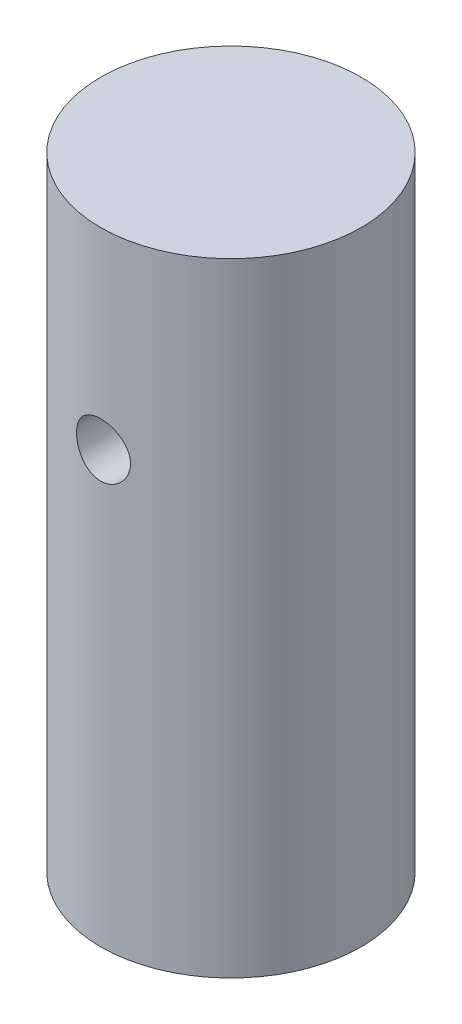
ISO-10303-21;
HEADER;
FILE_DESCRIPTION(('STEP AP214'),'2;1');
FILE_NAME('part.step','',(''),(''),'','','');
FILE_SCHEMA(('AUTOMOTIVE_DESIGN { 1 0 10303 214 1 1 1 1 }'));
ENDSEC;
DATA;
#1=APPLICATION_CONTEXT('core data for automotive mechanical design processes');
#2=APPLICATION_PROTOCOL_DEFINITION('international standard','automotive_design',2000,#1);
#3=PRODUCT_CONTEXT('',#1,'mechanical');
#4=PRODUCT('Part','Part','',(#3));
#5=PRODUCT_RELATED_PRODUCT_CATEGORY('part','',(#4));
#6=PRODUCT_DEFINITION_FORMATION('','',#4);
#7=PRODUCT_DEFINITION_CONTEXT('part definition',#1,'design');
#8=PRODUCT_DEFINITION('design','',#6,#7);
#9=PRODUCT_DEFINITION_SHAPE('','',#8);
#10=(LENGTH_UNIT() NAMED_UNIT(*) SI_UNIT(.MILLI.,.METRE.));
#11=(NAMED_UNIT(*) PLANE_ANGLE_UNIT() SI_UNIT($,.RADIAN.));
#12=(NAMED_UNIT(*) SI_UNIT($,.STERADIAN.) SOLID_ANGLE_UNIT());
#13=UNCERTAINTY_MEASURE_WITH_UNIT(LENGTH_MEASURE(1.E-05),#10,'distance_accuracy_value','');
#14=(GEOMETRIC_REPRESENTATION_CONTEXT(3) GLOBAL_UNCERTAINTY_ASSIGNED_CONTEXT((#13)) GLOBAL_UNIT_ASSIGNED_CONTEXT((#10,
#11,#12)) REPRESENTATION_CONTEXT('',''));
#15=CARTESIAN_POINT('',(0.,0.,0.));
#16=DIRECTION('',(0.,0.,1.));
#17=DIRECTION('',(1.,0.,0.));
#18=AXIS2_PLACEMENT_3D('',#15,#16,#17);
#19=CARTESIAN_POINT('',(0.,110.,0.));
#20=DIRECTION('',(0.,-1.,0.));
#21=DIRECTION('',(0.,0.,-1.));
#22=AXIS2_PLACEMENT_3D('',#19,#20,#21);
#23=CYLINDRICAL_SURFACE('',#22,23.);
#24=CARTESIAN_POINT('',(0.,80.7625,-23.));
#25=CARTESIAN_POINT('',(-0.264485032794885,80.7624905134433,-22.999995105829));
#26=CARTESIAN_POINT('',(-0.529088001707564,80.7403933447332,-22.9953912374659));
#27=CARTESIAN_POINT('',(-1.05080119514639,80.6526666070727,-22.9774697825828));
#28=CARTESIAN_POINT('',(-1.30790552969369,80.587003731269,-22.9641455292601));
#29=CARTESIAN_POINT('',(-1.80700413074042,80.4142718948397,-22.9302695755803));
#30=CARTESIAN_POINT('',(-2.04901308011091,80.3072439220144,-22.9097250314781));
#31=CARTESIAN_POINT('',(-2.51162532897361,80.0549449242048,-22.8636359691827));
#32=CARTESIAN_POINT('',(-2.73222963533514,79.9096756992747,-22.8380916863467));
#33=CARTESIAN_POINT('',(-3.14897535091243,79.5827914797964,-22.7843965936397));
#34=CARTESIAN_POINT('',(-3.34476261481203,79.4007297863869,-22.756216290215));
#35=CARTESIAN_POINT('',(-3.7032484752603,79.0063884952953,-22.7006373153975));
#36=CARTESIAN_POINT('',(-3.86594435767395,78.7941064213814,-22.6732387082773));
#37=CARTESIAN_POINT('',(-4.15515676952711,78.3427767069992,-22.6220363242689));
#38=CARTESIAN_POINT('',(-4.28130280415805,78.1034869725144,-22.5982704408082));
#39=CARTESIAN_POINT('',(-4.49146008129478,77.6065341001879,-22.5574449388681));
#40=CARTESIAN_POINT('',(-4.57547580463713,77.3488729196015,-22.5403846072508));
#41=CARTESIAN_POINT('',(-4.69783021579348,76.8263132389355,-22.5152010079109));
#42=CARTESIAN_POINT('',(-4.73679237252321,76.561566715561,-22.5069558757893));
#43=CARTESIAN_POINT('',(-4.769870971444,76.0291760947007,-22.4999697252763));
#44=CARTESIAN_POINT('',(-4.76399233704951,75.7615323185488,-22.5012276634698));
#45=CARTESIAN_POINT('',(-4.70805944236785,75.2355328503621,-22.5129949398179));
#46=CARTESIAN_POINT('',(-4.65872338051958,74.977096917896,-22.5233538635158));
#47=CARTESIAN_POINT('',(-4.5184112889846,74.4722513499182,-22.5519187300214));
#48=CARTESIAN_POINT('',(-4.42743314224264,74.2258423265511,-22.5701250717838));
#49=CARTESIAN_POINT('',(-4.20574335961059,73.7499941399755,-22.6124851139095));
#50=CARTESIAN_POINT('',(-4.07475019388072,73.5206900217328,-22.6366807158554));
#51=CARTESIAN_POINT('',(-3.77694717065477,73.0870494596982,-22.6882665925958));
#52=CARTESIAN_POINT('',(-3.61013291403111,72.8827160873619,-22.715657259582));
#53=CARTESIAN_POINT('',(-3.2415936049543,72.5006764651028,-22.7711963726726));
#54=CARTESIAN_POINT('',(-3.03925639596571,72.3235608549928,-22.7993492357394));
#55=CARTESIAN_POINT('',(-2.60744078443593,72.0056871640821,-22.8527570789761));
#56=CARTESIAN_POINT('',(-2.37796198419619,71.8649296161227,-22.8780120166726));
#57=CARTESIAN_POINT('',(-1.89769739115524,71.6236449989013,-22.9228475476254));
#58=CARTESIAN_POINT('',(-1.64687486034917,71.5231890690433,-22.9424180902752));
#59=CARTESIAN_POINT('',(-1.13141672629778,71.3660085038752,-22.9736041230192));
#60=CARTESIAN_POINT('',(-0.866782923819518,71.3092781825845,-22.9852206474143));
#61=CARTESIAN_POINT('',(-0.336286391951818,71.2420037947562,-22.999044565326));
#62=CARTESIAN_POINT('',(-0.0705302552791218,71.2306519818368,-23.001416495134));
#63=CARTESIAN_POINT('',(0.459081137409283,71.2522763460083,-22.9969424779101));
#64=CARTESIAN_POINT('',(0.722936507368175,71.2852498433698,-22.9900970881203));
#65=CARTESIAN_POINT('',(1.23862473603839,71.3939181761444,-22.9680608684261));
#66=CARTESIAN_POINT('',(1.4905494418103,71.4691951674719,-22.9529517007581));
#67=CARTESIAN_POINT('',(1.97819939632065,71.6598744134402,-22.9160768644794));
#68=CARTESIAN_POINT('',(2.21392336608105,71.7752798316989,-22.894310671063));
#69=CARTESIAN_POINT('',(2.66586273277865,72.0446636749177,-22.8461276500365));
#70=CARTESIAN_POINT('',(2.88178465140763,72.1991240863952,-22.8196540379669));
#71=CARTESIAN_POINT('',(3.28493419413082,72.5415919486658,-22.7651195022862));
#72=CARTESIAN_POINT('',(3.47215849954336,72.7296032739585,-22.7370583956053));
#73=CARTESIAN_POINT('',(3.81574381491093,73.1375243762204,-22.6819518340052));
#74=CARTESIAN_POINT('',(3.97154847202755,73.3579066082711,-22.6549305746642));
#75=CARTESIAN_POINT('',(4.24393258646674,73.8221871708128,-22.6054922142565));
#76=CARTESIAN_POINT('',(4.36051366787961,74.066084527099,-22.583074922573));
#77=CARTESIAN_POINT('',(4.55039940006842,74.5692081224604,-22.5455814708233));
#78=CARTESIAN_POINT('',(4.62393632266113,74.8283436269943,-22.5304659880476));
#79=CARTESIAN_POINT('',(4.72634263973249,75.3556419645916,-22.5092085590809));
#80=CARTESIAN_POINT('',(4.75521833570218,75.623803518665,-22.5030653469511));
#81=CARTESIAN_POINT('',(4.7672363047718,76.1559475889916,-22.5005218227369));
#82=CARTESIAN_POINT('',(4.75125874588723,76.4199097200193,-22.5039339993349));
#83=CARTESIAN_POINT('',(4.67597553546393,76.9412951890929,-22.519695951911));
#84=CARTESIAN_POINT('',(4.61667028902713,77.1987185882507,-22.5320456443258));
#85=CARTESIAN_POINT('',(4.45681999522922,77.6991081014148,-22.5642044708389));
#86=CARTESIAN_POINT('',(4.35639030971162,77.9421124976812,-22.5839927257291));
#87=CARTESIAN_POINT('',(4.11724613248071,78.4079576682582,-22.6288095045367));
#88=CARTESIAN_POINT('',(3.9785281392503,78.6307965959334,-22.653838507677));
#89=CARTESIAN_POINT('',(3.66377075266025,79.0543520559095,-22.7068853991179));
#90=CARTESIAN_POINT('',(3.4870987517987,79.2545927965454,-22.7349493498933));
#91=CARTESIAN_POINT('',(3.10274590710945,79.6228756602497,-22.7905813700966));
#92=CARTESIAN_POINT('',(2.89505793652407,79.7909103627942,-22.8181493239204));
#93=CARTESIAN_POINT('',(2.45172867703994,80.0918243948902,-22.8700535089474));
#94=CARTESIAN_POINT('',(2.21579652351638,80.2242824783641,-22.8943494507226));
#95=CARTESIAN_POINT('',(1.72457693749545,80.4474579564521,-22.9365730516973));
#96=CARTESIAN_POINT('',(1.46930673964661,80.53821202081,-22.9545063023447));
#97=CARTESIAN_POINT('',(1.01131316686297,80.6583382446479,-22.9786036474701));
#98=CARTESIAN_POINT('',(0.811151642646776,80.6973274963359,-22.9865793280369));
#99=CARTESIAN_POINT('',(0.407349982686114,80.7494115595136,-22.9972792942033));
#100=CARTESIAN_POINT('',(0.203709972906311,80.7625073066751,-23.0000037695572));
#101=CARTESIAN_POINT('',(0.,80.7625,-23.));
#102=B_SPLINE_CURVE_WITH_KNOTS('',3,(#24,#25,#26,#27,#28,#29,#30,#31,#32,#33,#34,#35,#36,#37,
#38,#39,#40,#41,#42,#43,#44,#45,#46,#47,#48,#49,#50,#51,#52,#53,#54,#55,#56,#57,#58,#59,#60,#61,
#62,#63,#64,#65,#66,#67,#68,#69,#70,#71,#72,#73,#74,#75,#76,#77,#78,#79,#80,#81,#82,#83,#84,#85,
#86,#87,#88,#89,#90,#91,#92,#93,#94,#95,#96,#97,#98,#99,#100,#101),.UNSPECIFIED.,.T.,.F.,(4,2,2,
2,2,2,2,2,2,2,2,2,2,2,2,2,2,2,2,2,2,2,2,2,2,2,2,2,2,2,2,2,2,2,2,2,2,2,4),(0.,0.792709711547572,
1.58602616491922,2.37855854484269,3.17105362613837,3.97382083841876,4.7766538666508,
5.58736101762054,6.39798192623854,7.19724558194627,7.99642148162914,8.78263252924878,
9.56888355174339,10.3607989585112,11.1528116747472,11.9601245588737,12.7674492738084,
13.5761928533042,14.3848312478404,15.1790098599838,15.973140461449,16.7595616844258,
17.546044920811,18.3427533445628,19.139553832768,19.9494183809314,20.7592493917375,
21.5646691751895,22.3699753072914,23.1595897719632,23.9491968540523,24.7366039494365,
25.5240830781282,26.3258774176583,27.1278562753943,27.9389496508181,28.7493284724073,
29.3599063479105,29.97046215954),.UNSPECIFIED.);
#103=CARTESIAN_POINT('',(0.,80.7625,-23.));
#104=VERTEX_POINT('',#103);
#105=EDGE_CURVE('E43',#104,#104,#102,.T.);
#106=ORIENTED_EDGE('',*,*,#105,.T.);
#107=EDGE_LOOP('',(#106));
#108=FACE_BOUND('',#107,.T.);
#109=CARTESIAN_POINT('',(4.7625,76.,22.5015242539256));
#110=CARTESIAN_POINT('',(4.76249046205908,75.7355834877217,22.5015295626443));
#111=CARTESIAN_POINT('',(4.7404043533248,75.4710489056753,22.5062357186516));
#112=CARTESIAN_POINT('',(4.65272552487099,74.9494776926476,22.5245216697782));
#113=CARTESIAN_POINT('',(4.5870992295924,74.6924470080374,22.5381083128721));
#114=CARTESIAN_POINT('',(4.41447433095943,74.1935044166748,22.5725519965029));
#115=CARTESIAN_POINT('',(4.30751843215665,73.9515772027253,22.5934015303446));
#116=CARTESIAN_POINT('',(4.05538935176247,73.4891028484194,22.6400128158409));
#117=CARTESIAN_POINT('',(3.91021780541216,73.2685547938047,22.6657743572986));
#118=CARTESIAN_POINT('',(3.58343390611814,72.851749493487,22.7197430133458));
#119=CARTESIAN_POINT('',(3.40135290885844,72.6558633023919,22.7479786175197));
#120=CARTESIAN_POINT('',(3.00693096818872,72.2971853885584,22.8034637061877));
#121=CARTESIAN_POINT('',(2.79458782272736,72.1343960762366,22.8307131187397));
#122=CARTESIAN_POINT('',(2.34320071056675,71.8450827453038,22.8814639455203));
#123=CARTESIAN_POINT('',(2.1039251446384,71.718912921109,22.9049278381686));
#124=CARTESIAN_POINT('',(1.60700288745209,71.5087078038855,22.9451431887501));
#125=CARTESIAN_POINT('',(1.349358043739,71.4246682802856,22.96189532062));
#126=CARTESIAN_POINT('',(0.826864446441515,71.3022688390128,22.986598345839));
#127=CARTESIAN_POINT('',(0.562168404344611,71.2632818042761,22.994669956644));
#128=CARTESIAN_POINT('',(0.0298778160691214,71.230135935209,23.0015198994738));
#129=CARTESIAN_POINT('',(-0.237716428751428,71.2359724839275,23.0002991886333));
#130=CARTESIAN_POINT('',(-0.763893052143684,71.2918356082539,22.9887950993595));
#131=CARTESIAN_POINT('',(-1.02255063712661,71.3411865184128,22.9786502946261));
#132=CARTESIAN_POINT('',(-1.52783170069267,71.4816039420925,22.9505947453545));
#133=CARTESIAN_POINT('',(-1.77445467337136,71.5726722076357,22.9326836746547));
#134=CARTESIAN_POINT('',(-2.2505742299152,71.7945547451678,22.8908817219676));
#135=CARTESIAN_POINT('',(-2.47994535067997,71.9256305585125,22.8669516789209));
#136=CARTESIAN_POINT('',(-2.91368552821268,72.2236133666427,22.8157446729446));
#137=CARTESIAN_POINT('',(-3.11805150737002,72.3905247650899,22.7884672988543));
#138=CARTESIAN_POINT('',(-3.49999331594205,72.7591371780072,22.7329726823724));
#139=CARTESIAN_POINT('',(-3.67699771157897,72.961429556104,22.7047474007434));
#140=CARTESIAN_POINT('',(-3.99466780021392,73.3931144591973,22.6510190277398));
#141=CARTESIAN_POINT('',(-4.13533270336623,73.6225075730755,22.6255159955409));
#142=CARTESIAN_POINT('',(-4.37654859954899,74.1027407329469,22.580101765269));
#143=CARTESIAN_POINT('',(-4.4770014247108,74.3536314708938,22.5602042863954));
#144=CARTESIAN_POINT('',(-4.63415528903713,74.8692390139159,22.5284508665047));
#145=CARTESIAN_POINT('',(-4.69086247985938,75.1339538694055,22.5165937948471));
#146=CARTESIAN_POINT('',(-4.75804950761484,75.6645006795299,22.502491737538));
#147=CARTESIAN_POINT('',(-4.7693570554371,75.9302233594665,22.5000746674945));
#148=CARTESIAN_POINT('',(-4.74765612567503,76.4597575522274,22.5046635287332));
#149=CARTESIAN_POINT('',(-4.71465035428901,76.7235691807698,22.5116688845914));
#150=CARTESIAN_POINT('',(-4.60597498431511,77.2389739509913,22.5341516177608));
#151=CARTESIAN_POINT('',(-4.53075263176839,77.4906656267722,22.5495401338496));
#152=CARTESIAN_POINT('',(-4.34025981011738,77.9778734401297,22.586976549794));
#153=CARTESIAN_POINT('',(-4.2249858420312,78.2133881623045,22.6090250314543));
#154=CARTESIAN_POINT('',(-3.95580679738079,78.6651638799509,22.6576805414651));
#155=CARTESIAN_POINT('',(-3.8013867512216,78.8811115486943,22.6843467036167));
#156=CARTESIAN_POINT('',(-3.45898075371295,79.2843315575632,22.7390730675012));
#157=CARTESIAN_POINT('',(-3.27099108681453,79.471600719231,22.7671334232977));
#158=CARTESIAN_POINT('',(-2.86305541668142,79.815313388682,22.8220482119399));
#159=CARTESIAN_POINT('',(-2.64263208474486,79.9711955215941,22.8488750057558));
#160=CARTESIAN_POINT('',(-2.1782457086542,80.2437154518817,22.8978094350618));
#161=CARTESIAN_POINT('',(-1.93428369756213,80.3603549705239,22.91991727752));
#162=CARTESIAN_POINT('',(-1.43117661921695,80.5502737727392,22.956805358988));
#163=CARTESIAN_POINT('',(-1.17213195198192,80.6238102207276,22.9716289700452));
#164=CARTESIAN_POINT('',(-0.645027648067564,80.7262462493342,22.9924649621731));
#165=CARTESIAN_POINT('',(-0.376969183816907,80.7551516123664,22.9984784846757));
#166=CARTESIAN_POINT('',(0.155203721779334,80.7672677089495,23.0009872107369));
#167=CARTESIAN_POINT('',(0.419298528855378,80.7513202508571,22.9976577679496));
#168=CARTESIAN_POINT('',(0.940957431517613,80.676051001106,22.9822259174686));
#169=CARTESIAN_POINT('',(1.19852162159041,80.61672983736,22.9701236367776));
#170=CARTESIAN_POINT('',(1.69923676432686,80.4567822577562,22.9385138561599));
#171=CARTESIAN_POINT('',(1.94242348277666,80.3562637400257,22.919025710182));
#172=CARTESIAN_POINT('',(2.40859706238195,80.1168847431776,22.8747360947514));
#173=CARTESIAN_POINT('',(2.63158218725238,79.9780209725092,22.8499341692056));
#174=CARTESIAN_POINT('',(3.05516494990757,79.663088385578,22.7972007062831));
#175=CARTESIAN_POINT('',(3.25531183143737,79.4864210222594,22.7692226979241));
#176=CARTESIAN_POINT('',(3.62340748854167,79.1021179296102,22.713556686797));
#177=CARTESIAN_POINT('',(3.79134858432657,78.8944748347437,22.6858687546848));
#178=CARTESIAN_POINT('',(4.09214324446425,78.4511955164006,22.6335593234378));
#179=CARTESIAN_POINT('',(4.22456309354906,78.2152600780019,22.6089775109707));
#180=CARTESIAN_POINT('',(4.44766622276509,77.7240373046022,22.5661532413477));
#181=CARTESIAN_POINT('',(4.53838643999933,77.4687673303403,22.5479051773457));
#182=CARTESIAN_POINT('',(4.65843219883151,77.0108600139995,22.5233591858118));
#183=CARTESIAN_POINT('',(4.69738598724383,76.8107895872438,22.5152231342626));
#184=CARTESIAN_POINT('',(4.74942305161473,76.4071693544361,22.5043037295164));
#185=CARTESIAN_POINT('',(4.76250734489882,76.2036196855239,22.5015201658313));
#186=CARTESIAN_POINT('',(4.7625,76.,22.5015242539256));
#187=B_SPLINE_CURVE_WITH_KNOTS('',3,(#109,#110,#111,#112,#113,#114,#115,#116,#117,#118,#119,
#120,#121,#122,#123,#124,#125,#126,#127,#128,#129,#130,#131,#132,#133,#134,#135,#136,#137,#138,
#139,#140,#141,#142,#143,#144,#145,#146,#147,#148,#149,#150,#151,#152,#153,#154,#155,#156,#157,
#158,#159,#160,#161,#162,#163,#164,#165,#166,#167,#168,#169,#170,#171,#172,#173,#174,#175,#176,
#177,#178,#179,#180,#181,#182,#183,#184,#185,#186),.UNSPECIFIED.,.T.,.F.,(4,2,2,2,2,2,2,2,2,2,2,
2,2,2,2,2,2,2,2,2,2,2,2,2,2,2,2,2,2,2,2,2,2,2,2,2,2,2,4),(0.,0.792503738229282,1.58561931884712,
2.37791758053016,3.17018194541399,3.97321867408587,4.77631386628271,5.58693602580817,
6.39747676929736,7.19659370702667,7.99562833464129,8.78247029722793,9.56934530820129,
10.3614787216093,11.15370953223,11.9607318918169,12.7677717907118,13.5767700361048,
14.3856544967044,15.1797227961829,15.9737426044048,16.759505113361,17.545336285225,
18.3420964834887,19.1389449233962,19.9489794144729,20.7589783710342,21.5640941282907,
22.3691055658007,23.159109720529,23.9491024387488,24.737039211817,25.5250436422966,
26.3265945012819,27.1283362610035,27.93946254369,28.7498689479036,29.3601776870888,
29.9704624252256),.UNSPECIFIED.);
#188=CARTESIAN_POINT('',(4.7625,76.,22.5015242539256));
#189=VERTEX_POINT('',#188);
#190=EDGE_CURVE('E60',#189,#189,#187,.T.);
#191=ORIENTED_EDGE('',*,*,#190,.T.);
#192=EDGE_LOOP('',(#191));
#193=FACE_BOUND('',#192,.T.);
#194=CARTESIAN_POINT('',(0.,110.,0.));
#195=DIRECTION('',(0.,1.,0.));
#196=DIRECTION('',(0.,0.,1.));
#197=AXIS2_PLACEMENT_3D('',#194,#195,#196);
#198=CIRCLE('',#197,23.);
#199=CARTESIAN_POINT('',(0.,110.,23.));
#200=VERTEX_POINT('',#199);
#201=EDGE_CURVE('E10',#200,#200,#198,.T.);
#202=ORIENTED_EDGE('',*,*,#201,.F.);
#203=EDGE_LOOP('',(#202));
#204=FACE_BOUND('',#203,.T.);
#205=CARTESIAN_POINT('',(0.,0.,0.));
#206=DIRECTION('',(0.,1.,0.));
#207=DIRECTION('',(0.,0.,1.));
#208=AXIS2_PLACEMENT_3D('',#205,#206,#207);
#209=CIRCLE('',#208,23.);
#210=CARTESIAN_POINT('',(0.,0.,23.));
#211=VERTEX_POINT('',#210);
#212=EDGE_CURVE('E51',#211,#211,#209,.T.);
#213=ORIENTED_EDGE('',*,*,#212,.T.);
#214=EDGE_LOOP('',(#213));
#215=FACE_BOUND('',#214,.T.);
#216=ADVANCED_FACE('F39',(#108,#193,#204,#215),#23,.T.);
#217=CARTESIAN_POINT('',(0.,110.,0.));
#218=DIRECTION('',(0.,1.,0.));
#219=DIRECTION('',(0.,0.,1.));
#220=AXIS2_PLACEMENT_3D('',#217,#218,#219);
#221=PLANE('',#220);
#222=ORIENTED_EDGE('',*,*,#201,.T.);
#223=EDGE_LOOP('',(#222));
#224=FACE_BOUND('',#223,.T.);
#225=ADVANCED_FACE('F68',(#224),#221,.T.);
#226=CARTESIAN_POINT('',(0.,0.,0.));
#227=DIRECTION('',(0.,1.,0.));
#228=DIRECTION('',(0.,0.,1.));
#229=AXIS2_PLACEMENT_3D('',#226,#227,#228);
#230=PLANE('',#229);
#231=ORIENTED_EDGE('',*,*,#212,.F.);
#232=EDGE_LOOP('',(#231));
#233=FACE_BOUND('',#232,.T.);
#234=ADVANCED_FACE('F66',(#233),#230,.F.);
#235=CARTESIAN_POINT('',(0.,76.,-25.));
#236=DIRECTION('',(0.,0.,1.));
#237=DIRECTION('',(1.,0.,0.));
#238=AXIS2_PLACEMENT_3D('',#235,#236,#237);
#239=CYLINDRICAL_SURFACE('',#238,4.7625);
#240=ORIENTED_EDGE('',*,*,#190,.F.);
#241=EDGE_LOOP('',(#240));
#242=FACE_BOUND('',#241,.T.);
#243=ORIENTED_EDGE('',*,*,#105,.F.);
#244=EDGE_LOOP('',(#243));
#245=FACE_BOUND('',#244,.T.);
#246=ADVANCED_FACE('F61',(#242,#245),#239,.F.);
#247=CLOSED_SHELL('',(#216,#225,#234,#246));
#248=MANIFOLD_SOLID_BREP('B2',#247);
#249=ADVANCED_BREP_SHAPE_REPRESENTATION('',(#18,#248),#14);
#250=SHAPE_DEFINITION_REPRESENTATION(#9,#249);
ENDSEC;
END-ISO-10303-21;
